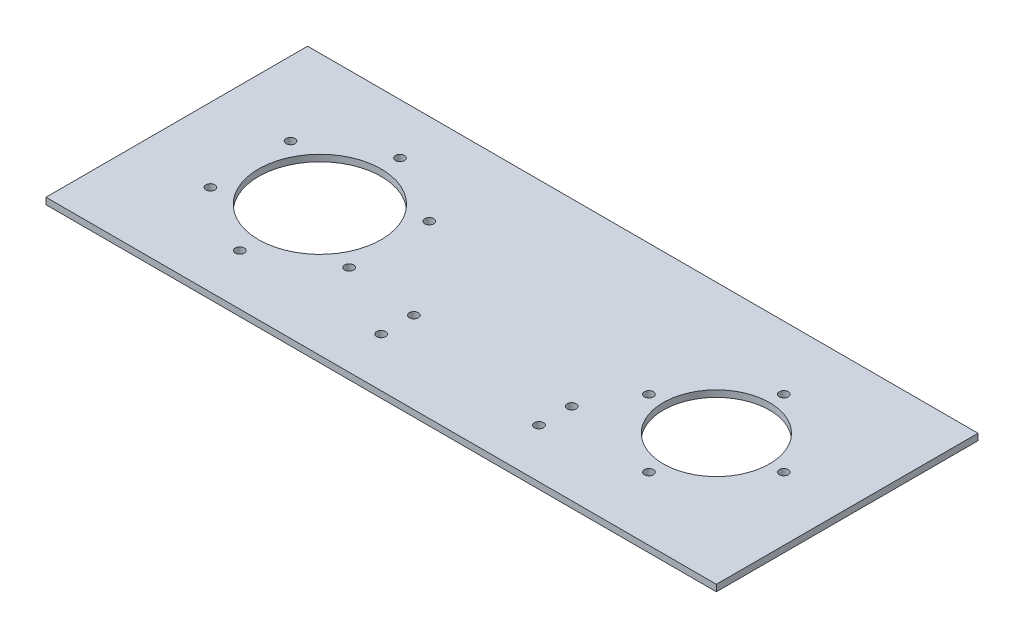
ISO-10303-21;
HEADER;
FILE_DESCRIPTION(('STEP AP214'),'2;1');
FILE_NAME('part.step','',(''),(''),'','','');
FILE_SCHEMA(('AUTOMOTIVE_DESIGN { 1 0 10303 214 1 1 1 1 }'));
ENDSEC;
DATA;
#1=APPLICATION_CONTEXT('core data for automotive mechanical design processes');
#2=APPLICATION_PROTOCOL_DEFINITION('international standard','automotive_design',2000,#1);
#3=PRODUCT_CONTEXT('',#1,'mechanical');
#4=PRODUCT('Part','Part','',(#3));
#5=PRODUCT_RELATED_PRODUCT_CATEGORY('part','',(#4));
#6=PRODUCT_DEFINITION_FORMATION('','',#4);
#7=PRODUCT_DEFINITION_CONTEXT('part definition',#1,'design');
#8=PRODUCT_DEFINITION('design','',#6,#7);
#9=PRODUCT_DEFINITION_SHAPE('','',#8);
#10=(LENGTH_UNIT() NAMED_UNIT(*) SI_UNIT(.MILLI.,.METRE.));
#11=(NAMED_UNIT(*) PLANE_ANGLE_UNIT() SI_UNIT($,.RADIAN.));
#12=(NAMED_UNIT(*) SI_UNIT($,.STERADIAN.) SOLID_ANGLE_UNIT());
#13=UNCERTAINTY_MEASURE_WITH_UNIT(LENGTH_MEASURE(1.E-05),#10,'distance_accuracy_value','');
#14=(GEOMETRIC_REPRESENTATION_CONTEXT(3) GLOBAL_UNCERTAINTY_ASSIGNED_CONTEXT((#13)) GLOBAL_UNIT_ASSIGNED_CONTEXT((#10,
#11,#12)) REPRESENTATION_CONTEXT('',''));
#15=CARTESIAN_POINT('',(0.,0.,0.));
#16=DIRECTION('',(0.,0.,1.));
#17=DIRECTION('',(1.,0.,0.));
#18=AXIS2_PLACEMENT_3D('',#15,#16,#17);
#19=CARTESIAN_POINT('',(0.,8.,160.));
#20=DIRECTION('',(0.,0.,-1.));
#21=DIRECTION('',(-1.,0.,0.));
#22=AXIS2_PLACEMENT_3D('',#19,#20,#21);
#23=PLANE('',#22);
#24=DIRECTION('',(1.,0.,0.));
#25=VECTOR('',#24,1.);
#26=CARTESIAN_POINT('',(0.,0.,160.));
#27=LINE('',#26,#25);
#28=CARTESIAN_POINT('',(-175.,0.,160.));
#29=VERTEX_POINT('',#28);
#30=CARTESIAN_POINT('',(645.,0.,160.));
#31=VERTEX_POINT('',#30);
#32=EDGE_CURVE('E137',#29,#31,#27,.T.);
#33=ORIENTED_EDGE('',*,*,#32,.T.);
#34=DIRECTION('',(0.,-1.,0.));
#35=VECTOR('',#34,1.);
#36=CARTESIAN_POINT('',(645.,8.,160.));
#37=LINE('',#36,#35);
#38=CARTESIAN_POINT('',(645.,8.,160.));
#39=VERTEX_POINT('',#38);
#40=EDGE_CURVE('E11',#39,#31,#37,.T.);
#41=ORIENTED_EDGE('',*,*,#40,.F.);
#42=DIRECTION('',(1.,0.,0.));
#43=VECTOR('',#42,1.);
#44=CARTESIAN_POINT('',(0.,8.,160.));
#45=LINE('',#44,#43);
#46=CARTESIAN_POINT('',(-175.,8.,160.));
#47=VERTEX_POINT('',#46);
#48=EDGE_CURVE('E86',#47,#39,#45,.T.);
#49=ORIENTED_EDGE('',*,*,#48,.F.);
#50=DIRECTION('',(0.,-1.,0.));
#51=VECTOR('',#50,1.);
#52=CARTESIAN_POINT('',(-175.,8.,160.));
#53=LINE('',#52,#51);
#54=EDGE_CURVE('E53',#47,#29,#53,.T.);
#55=ORIENTED_EDGE('',*,*,#54,.T.);
#56=EDGE_LOOP('',(#33,#41,#49,#55));
#57=FACE_BOUND('',#56,.T.);
#58=ADVANCED_FACE('F36',(#57),#23,.F.);
#59=CARTESIAN_POINT('',(645.,8.,0.));
#60=DIRECTION('',(-1.,0.,0.));
#61=DIRECTION('',(0.,0.,1.));
#62=AXIS2_PLACEMENT_3D('',#59,#60,#61);
#63=PLANE('',#62);
#64=DIRECTION('',(0.,0.,-1.));
#65=VECTOR('',#64,1.);
#66=CARTESIAN_POINT('',(645.,0.,0.));
#67=LINE('',#66,#65);
#68=CARTESIAN_POINT('',(645.,0.,-160.));
#69=VERTEX_POINT('',#68);
#70=EDGE_CURVE('E91',#31,#69,#67,.T.);
#71=ORIENTED_EDGE('',*,*,#70,.T.);
#72=DIRECTION('',(0.,-1.,0.));
#73=VECTOR('',#72,1.);
#74=CARTESIAN_POINT('',(645.,8.,-160.));
#75=LINE('',#74,#73);
#76=CARTESIAN_POINT('',(645.,8.,-160.));
#77=VERTEX_POINT('',#76);
#78=EDGE_CURVE('E45',#77,#69,#75,.T.);
#79=ORIENTED_EDGE('',*,*,#78,.F.);
#80=DIRECTION('',(0.,0.,-1.));
#81=VECTOR('',#80,1.);
#82=CARTESIAN_POINT('',(645.,8.,0.));
#83=LINE('',#82,#81);
#84=EDGE_CURVE('E78',#39,#77,#83,.T.);
#85=ORIENTED_EDGE('',*,*,#84,.F.);
#86=ORIENTED_EDGE('',*,*,#40,.T.);
#87=EDGE_LOOP('',(#71,#79,#85,#86));
#88=FACE_BOUND('',#87,.T.);
#89=ADVANCED_FACE('F90',(#88),#63,.F.);
#90=CARTESIAN_POINT('',(0.,8.,-160.));
#91=DIRECTION('',(0.,0.,-1.));
#92=DIRECTION('',(-1.,0.,0.));
#93=AXIS2_PLACEMENT_3D('',#90,#91,#92);
#94=PLANE('',#93);
#95=DIRECTION('',(1.,0.,0.));
#96=VECTOR('',#95,1.);
#97=CARTESIAN_POINT('',(0.,0.,-160.));
#98=LINE('',#97,#96);
#99=CARTESIAN_POINT('',(-175.,0.,-160.));
#100=VERTEX_POINT('',#99);
#101=EDGE_CURVE('E140',#100,#69,#98,.T.);
#102=ORIENTED_EDGE('',*,*,#101,.F.);
#103=DIRECTION('',(0.,-1.,0.));
#104=VECTOR('',#103,1.);
#105=CARTESIAN_POINT('',(-175.,8.,-160.));
#106=LINE('',#105,#104);
#107=CARTESIAN_POINT('',(-175.,8.,-160.));
#108=VERTEX_POINT('',#107);
#109=EDGE_CURVE('E67',#108,#100,#106,.T.);
#110=ORIENTED_EDGE('',*,*,#109,.F.);
#111=DIRECTION('',(1.,0.,0.));
#112=VECTOR('',#111,1.);
#113=CARTESIAN_POINT('',(0.,8.,-160.));
#114=LINE('',#113,#112);
#115=EDGE_CURVE('E85',#108,#77,#114,.T.);
#116=ORIENTED_EDGE('',*,*,#115,.T.);
#117=ORIENTED_EDGE('',*,*,#78,.T.);
#118=EDGE_LOOP('',(#102,#110,#116,#117));
#119=FACE_BOUND('',#118,.T.);
#120=ADVANCED_FACE('F94',(#119),#94,.T.);
#121=CARTESIAN_POINT('',(0.,8.,0.));
#122=DIRECTION('',(0.,-1.,0.));
#123=DIRECTION('',(0.,0.,-1.));
#124=AXIS2_PLACEMENT_3D('',#121,#122,#123);
#125=CYLINDRICAL_SURFACE('',#124,75.);
#126=CARTESIAN_POINT('',(0.,8.,0.));
#127=DIRECTION('',(0.,1.,0.));
#128=DIRECTION('',(0.,0.,1.));
#129=AXIS2_PLACEMENT_3D('',#126,#127,#128);
#130=CIRCLE('',#129,75.);
#131=CARTESIAN_POINT('',(0.,8.,75.));
#132=VERTEX_POINT('',#131);
#133=EDGE_CURVE('E185',#132,#132,#130,.T.);
#134=ORIENTED_EDGE('',*,*,#133,.T.);
#135=EDGE_LOOP('',(#134));
#136=FACE_BOUND('',#135,.T.);
#137=CARTESIAN_POINT('',(0.,0.,0.));
#138=DIRECTION('',(0.,1.,0.));
#139=DIRECTION('',(0.,0.,1.));
#140=AXIS2_PLACEMENT_3D('',#137,#138,#139);
#141=CIRCLE('',#140,75.);
#142=CARTESIAN_POINT('',(0.,0.,75.));
#143=VERTEX_POINT('',#142);
#144=EDGE_CURVE('E134',#143,#143,#141,.T.);
#145=ORIENTED_EDGE('',*,*,#144,.F.);
#146=EDGE_LOOP('',(#145));
#147=FACE_BOUND('',#146,.T.);
#148=ADVANCED_FACE('F189',(#136,#147),#125,.F.);
#149=CARTESIAN_POINT('',(0.,8.,98.));
#150=DIRECTION('',(0.,-1.,0.));
#151=DIRECTION('',(0.,0.,-1.));
#152=AXIS2_PLACEMENT_3D('',#149,#150,#151);
#153=CYLINDRICAL_SURFACE('',#152,5.5);
#154=CARTESIAN_POINT('',(0.,8.,98.));
#155=DIRECTION('',(0.,1.,0.));
#156=DIRECTION('',(0.,0.,1.));
#157=AXIS2_PLACEMENT_3D('',#154,#155,#156);
#158=CIRCLE('',#157,5.5);
#159=CARTESIAN_POINT('',(0.,8.,103.5));
#160=VERTEX_POINT('',#159);
#161=EDGE_CURVE('E182',#160,#160,#158,.T.);
#162=ORIENTED_EDGE('',*,*,#161,.T.);
#163=EDGE_LOOP('',(#162));
#164=FACE_BOUND('',#163,.T.);
#165=CARTESIAN_POINT('',(0.,0.,98.));
#166=DIRECTION('',(0.,1.,0.));
#167=DIRECTION('',(0.,0.,1.));
#168=AXIS2_PLACEMENT_3D('',#165,#166,#167);
#169=CIRCLE('',#168,5.5);
#170=CARTESIAN_POINT('',(0.,0.,103.5));
#171=VERTEX_POINT('',#170);
#172=EDGE_CURVE('E131',#171,#171,#169,.T.);
#173=ORIENTED_EDGE('',*,*,#172,.F.);
#174=EDGE_LOOP('',(#173));
#175=FACE_BOUND('',#174,.T.);
#176=ADVANCED_FACE('F218',(#164,#175),#153,.F.);
#177=CARTESIAN_POINT('',(-84.8704895708751,8.,48.9999999999998));
#178=DIRECTION('',(0.,-1.,0.));
#179=DIRECTION('',(0.,0.,-1.));
#180=AXIS2_PLACEMENT_3D('',#177,#178,#179);
#181=CYLINDRICAL_SURFACE('',#180,5.5);
#182=CARTESIAN_POINT('',(-84.8704895708751,8.,48.9999999999998));
#183=DIRECTION('',(0.,1.,0.));
#184=DIRECTION('',(0.,0.,1.));
#185=AXIS2_PLACEMENT_3D('',#182,#183,#184);
#186=CIRCLE('',#185,5.5);
#187=CARTESIAN_POINT('',(-84.8704895708751,8.,54.4999999999998));
#188=VERTEX_POINT('',#187);
#189=EDGE_CURVE('E179',#188,#188,#186,.T.);
#190=ORIENTED_EDGE('',*,*,#189,.T.);
#191=EDGE_LOOP('',(#190));
#192=FACE_BOUND('',#191,.T.);
#193=CARTESIAN_POINT('',(-84.8704895708751,0.,48.9999999999998));
#194=DIRECTION('',(0.,1.,0.));
#195=DIRECTION('',(0.,0.,1.));
#196=AXIS2_PLACEMENT_3D('',#193,#194,#195);
#197=CIRCLE('',#196,5.5);
#198=CARTESIAN_POINT('',(-84.8704895708751,0.,54.4999999999998));
#199=VERTEX_POINT('',#198);
#200=EDGE_CURVE('E128',#199,#199,#197,.T.);
#201=ORIENTED_EDGE('',*,*,#200,.F.);
#202=EDGE_LOOP('',(#201));
#203=FACE_BOUND('',#202,.T.);
#204=ADVANCED_FACE('F221',(#192,#203),#181,.F.);
#205=CARTESIAN_POINT('',(-84.8704895708748,8.,-49.0000000000004));
#206=DIRECTION('',(0.,-1.,0.));
#207=DIRECTION('',(0.,0.,-1.));
#208=AXIS2_PLACEMENT_3D('',#205,#206,#207);
#209=CYLINDRICAL_SURFACE('',#208,5.5);
#210=CARTESIAN_POINT('',(-84.8704895708748,8.,-49.0000000000004));
#211=DIRECTION('',(0.,1.,0.));
#212=DIRECTION('',(0.,0.,1.));
#213=AXIS2_PLACEMENT_3D('',#210,#211,#212);
#214=CIRCLE('',#213,5.5);
#215=CARTESIAN_POINT('',(-84.8704895708748,8.,-43.5000000000004));
#216=VERTEX_POINT('',#215);
#217=EDGE_CURVE('E176',#216,#216,#214,.T.);
#218=ORIENTED_EDGE('',*,*,#217,.T.);
#219=EDGE_LOOP('',(#218));
#220=FACE_BOUND('',#219,.T.);
#221=CARTESIAN_POINT('',(-84.8704895708748,0.,-49.0000000000004));
#222=DIRECTION('',(0.,1.,0.));
#223=DIRECTION('',(0.,0.,1.));
#224=AXIS2_PLACEMENT_3D('',#221,#222,#223);
#225=CIRCLE('',#224,5.5);
#226=CARTESIAN_POINT('',(-84.8704895708748,0.,-43.5000000000004));
#227=VERTEX_POINT('',#226);
#228=EDGE_CURVE('E125',#227,#227,#225,.T.);
#229=ORIENTED_EDGE('',*,*,#228,.F.);
#230=EDGE_LOOP('',(#229));
#231=FACE_BOUND('',#230,.T.);
#232=ADVANCED_FACE('F225',(#220,#231),#209,.F.);
#233=CARTESIAN_POINT('',(6.84330342413254E-13,8.,-98.));
#234=DIRECTION('',(0.,-1.,0.));
#235=DIRECTION('',(0.,0.,-1.));
#236=AXIS2_PLACEMENT_3D('',#233,#234,#235);
#237=CYLINDRICAL_SURFACE('',#236,5.5);
#238=CARTESIAN_POINT('',(6.84330342413254E-13,8.,-98.));
#239=DIRECTION('',(0.,1.,0.));
#240=DIRECTION('',(0.,0.,1.));
#241=AXIS2_PLACEMENT_3D('',#238,#239,#240);
#242=CIRCLE('',#241,5.5);
#243=CARTESIAN_POINT('',(6.84330342413254E-13,8.,-92.5));
#244=VERTEX_POINT('',#243);
#245=EDGE_CURVE('E173',#244,#244,#242,.T.);
#246=ORIENTED_EDGE('',*,*,#245,.T.);
#247=EDGE_LOOP('',(#246));
#248=FACE_BOUND('',#247,.T.);
#249=CARTESIAN_POINT('',(6.84330342413254E-13,0.,-98.));
#250=DIRECTION('',(0.,1.,0.));
#251=DIRECTION('',(0.,0.,1.));
#252=AXIS2_PLACEMENT_3D('',#249,#250,#251);
#253=CIRCLE('',#252,5.5);
#254=CARTESIAN_POINT('',(6.84330342413254E-13,0.,-92.5));
#255=VERTEX_POINT('',#254);
#256=EDGE_CURVE('E122',#255,#255,#253,.T.);
#257=ORIENTED_EDGE('',*,*,#256,.F.);
#258=EDGE_LOOP('',(#257));
#259=FACE_BOUND('',#258,.T.);
#260=ADVANCED_FACE('F229',(#248,#259),#237,.F.);
#261=CARTESIAN_POINT('',(84.8704895708754,8.,-48.9999999999992));
#262=DIRECTION('',(0.,-1.,0.));
#263=DIRECTION('',(0.,0.,-1.));
#264=AXIS2_PLACEMENT_3D('',#261,#262,#263);
#265=CYLINDRICAL_SURFACE('',#264,5.5);
#266=CARTESIAN_POINT('',(84.8704895708754,8.,-48.9999999999992));
#267=DIRECTION('',(0.,1.,0.));
#268=DIRECTION('',(0.,0.,1.));
#269=AXIS2_PLACEMENT_3D('',#266,#267,#268);
#270=CIRCLE('',#269,5.5);
#271=CARTESIAN_POINT('',(84.8704895708754,8.,-43.4999999999992));
#272=VERTEX_POINT('',#271);
#273=EDGE_CURVE('E170',#272,#272,#270,.T.);
#274=ORIENTED_EDGE('',*,*,#273,.T.);
#275=EDGE_LOOP('',(#274));
#276=FACE_BOUND('',#275,.T.);
#277=CARTESIAN_POINT('',(84.8704895708754,0.,-48.9999999999992));
#278=DIRECTION('',(0.,1.,0.));
#279=DIRECTION('',(0.,0.,1.));
#280=AXIS2_PLACEMENT_3D('',#277,#278,#279);
#281=CIRCLE('',#280,5.5);
#282=CARTESIAN_POINT('',(84.8704895708754,0.,-43.4999999999992));
#283=VERTEX_POINT('',#282);
#284=EDGE_CURVE('E119',#283,#283,#281,.T.);
#285=ORIENTED_EDGE('',*,*,#284,.F.);
#286=EDGE_LOOP('',(#285));
#287=FACE_BOUND('',#286,.T.);
#288=ADVANCED_FACE('F233',(#276,#287),#265,.F.);
#289=CARTESIAN_POINT('',(84.8704895708744,8.,49.000000000001));
#290=DIRECTION('',(0.,-1.,0.));
#291=DIRECTION('',(0.,0.,-1.));
#292=AXIS2_PLACEMENT_3D('',#289,#290,#291);
#293=CYLINDRICAL_SURFACE('',#292,5.5);
#294=CARTESIAN_POINT('',(84.8704895708744,8.,49.000000000001));
#295=DIRECTION('',(0.,1.,0.));
#296=DIRECTION('',(0.,0.,1.));
#297=AXIS2_PLACEMENT_3D('',#294,#295,#296);
#298=CIRCLE('',#297,5.5);
#299=CARTESIAN_POINT('',(84.8704895708744,8.,54.500000000001));
#300=VERTEX_POINT('',#299);
#301=EDGE_CURVE('E167',#300,#300,#298,.T.);
#302=ORIENTED_EDGE('',*,*,#301,.T.);
#303=EDGE_LOOP('',(#302));
#304=FACE_BOUND('',#303,.T.);
#305=CARTESIAN_POINT('',(84.8704895708744,0.,49.000000000001));
#306=DIRECTION('',(0.,1.,0.));
#307=DIRECTION('',(0.,0.,1.));
#308=AXIS2_PLACEMENT_3D('',#305,#306,#307);
#309=CIRCLE('',#308,5.5);
#310=CARTESIAN_POINT('',(84.8704895708744,0.,54.500000000001));
#311=VERTEX_POINT('',#310);
#312=EDGE_CURVE('E116',#311,#311,#309,.T.);
#313=ORIENTED_EDGE('',*,*,#312,.F.);
#314=EDGE_LOOP('',(#313));
#315=FACE_BOUND('',#314,.T.);
#316=ADVANCED_FACE('F237',(#304,#315),#293,.F.);
#317=CARTESIAN_POINT('',(485.,8.,0.));
#318=DIRECTION('',(0.,-1.,0.));
#319=DIRECTION('',(0.,0.,-1.));
#320=AXIS2_PLACEMENT_3D('',#317,#318,#319);
#321=CYLINDRICAL_SURFACE('',#320,64.9999999999999);
#322=CARTESIAN_POINT('',(485.,8.,0.));
#323=DIRECTION('',(0.,1.,0.));
#324=DIRECTION('',(0.,0.,1.));
#325=AXIS2_PLACEMENT_3D('',#322,#323,#324);
#326=CIRCLE('',#325,64.9999999999999);
#327=CARTESIAN_POINT('',(485.,8.,64.9999999999999));
#328=VERTEX_POINT('',#327);
#329=EDGE_CURVE('E164',#328,#328,#326,.T.);
#330=ORIENTED_EDGE('',*,*,#329,.T.);
#331=EDGE_LOOP('',(#330));
#332=FACE_BOUND('',#331,.T.);
#333=CARTESIAN_POINT('',(485.,0.,0.));
#334=DIRECTION('',(0.,1.,0.));
#335=DIRECTION('',(0.,0.,1.));
#336=AXIS2_PLACEMENT_3D('',#333,#334,#335);
#337=CIRCLE('',#336,64.9999999999999);
#338=CARTESIAN_POINT('',(485.,0.,64.9999999999999));
#339=VERTEX_POINT('',#338);
#340=EDGE_CURVE('E113',#339,#339,#337,.T.);
#341=ORIENTED_EDGE('',*,*,#340,.F.);
#342=EDGE_LOOP('',(#341));
#343=FACE_BOUND('',#342,.T.);
#344=ADVANCED_FACE('F241',(#332,#343),#321,.F.);
#345=CARTESIAN_POINT('',(567.5,8.,0.));
#346=DIRECTION('',(0.,-1.,0.));
#347=DIRECTION('',(0.,0.,-1.));
#348=AXIS2_PLACEMENT_3D('',#345,#346,#347);
#349=CYLINDRICAL_SURFACE('',#348,5.50000000000007);
#350=CARTESIAN_POINT('',(567.5,8.,0.));
#351=DIRECTION('',(0.,1.,0.));
#352=DIRECTION('',(0.,0.,1.));
#353=AXIS2_PLACEMENT_3D('',#350,#351,#352);
#354=CIRCLE('',#353,5.50000000000007);
#355=CARTESIAN_POINT('',(567.5,8.,5.50000000000007));
#356=VERTEX_POINT('',#355);
#357=EDGE_CURVE('E161',#356,#356,#354,.T.);
#358=ORIENTED_EDGE('',*,*,#357,.T.);
#359=EDGE_LOOP('',(#358));
#360=FACE_BOUND('',#359,.T.);
#361=CARTESIAN_POINT('',(567.5,0.,0.));
#362=DIRECTION('',(0.,1.,0.));
#363=DIRECTION('',(0.,0.,1.));
#364=AXIS2_PLACEMENT_3D('',#361,#362,#363);
#365=CIRCLE('',#364,5.50000000000007);
#366=CARTESIAN_POINT('',(567.5,0.,5.50000000000007));
#367=VERTEX_POINT('',#366);
#368=EDGE_CURVE('E110',#367,#367,#365,.T.);
#369=ORIENTED_EDGE('',*,*,#368,.F.);
#370=EDGE_LOOP('',(#369));
#371=FACE_BOUND('',#370,.T.);
#372=ADVANCED_FACE('F245',(#360,#371),#349,.F.);
#373=CARTESIAN_POINT('',(485.,8.,82.5));
#374=DIRECTION('',(0.,-1.,0.));
#375=DIRECTION('',(0.,0.,-1.));
#376=AXIS2_PLACEMENT_3D('',#373,#374,#375);
#377=CYLINDRICAL_SURFACE('',#376,5.50000000000007);
#378=CARTESIAN_POINT('',(485.,8.,82.5));
#379=DIRECTION('',(0.,1.,0.));
#380=DIRECTION('',(0.,0.,1.));
#381=AXIS2_PLACEMENT_3D('',#378,#379,#380);
#382=CIRCLE('',#381,5.50000000000007);
#383=CARTESIAN_POINT('',(485.,8.,88.0000000000001));
#384=VERTEX_POINT('',#383);
#385=EDGE_CURVE('E154',#384,#384,#382,.T.);
#386=ORIENTED_EDGE('',*,*,#385,.T.);
#387=EDGE_LOOP('',(#386));
#388=FACE_BOUND('',#387,.T.);
#389=CARTESIAN_POINT('',(485.,0.,82.5));
#390=DIRECTION('',(0.,1.,0.));
#391=DIRECTION('',(0.,0.,1.));
#392=AXIS2_PLACEMENT_3D('',#389,#390,#391);
#393=CIRCLE('',#392,5.50000000000007);
#394=CARTESIAN_POINT('',(485.,0.,88.0000000000001));
#395=VERTEX_POINT('',#394);
#396=EDGE_CURVE('E107',#395,#395,#393,.T.);
#397=ORIENTED_EDGE('',*,*,#396,.F.);
#398=EDGE_LOOP('',(#397));
#399=FACE_BOUND('',#398,.T.);
#400=ADVANCED_FACE('F249',(#388,#399),#377,.F.);
#401=CARTESIAN_POINT('',(402.5,8.,0.));
#402=DIRECTION('',(0.,-1.,0.));
#403=DIRECTION('',(0.,0.,-1.));
#404=AXIS2_PLACEMENT_3D('',#401,#402,#403);
#405=CYLINDRICAL_SURFACE('',#404,5.50000000000007);
#406=CARTESIAN_POINT('',(402.5,8.,0.));
#407=DIRECTION('',(0.,1.,0.));
#408=DIRECTION('',(0.,0.,1.));
#409=AXIS2_PLACEMENT_3D('',#406,#407,#408);
#410=CIRCLE('',#409,5.50000000000007);
#411=CARTESIAN_POINT('',(402.5,8.,5.50000000000006));
#412=VERTEX_POINT('',#411);
#413=EDGE_CURVE('E149',#412,#412,#410,.T.);
#414=ORIENTED_EDGE('',*,*,#413,.T.);
#415=EDGE_LOOP('',(#414));
#416=FACE_BOUND('',#415,.T.);
#417=CARTESIAN_POINT('',(402.5,0.,0.));
#418=DIRECTION('',(0.,1.,0.));
#419=DIRECTION('',(0.,0.,1.));
#420=AXIS2_PLACEMENT_3D('',#417,#418,#419);
#421=CIRCLE('',#420,5.50000000000007);
#422=CARTESIAN_POINT('',(402.5,0.,5.50000000000006));
#423=VERTEX_POINT('',#422);
#424=EDGE_CURVE('E103',#423,#423,#421,.T.);
#425=ORIENTED_EDGE('',*,*,#424,.F.);
#426=EDGE_LOOP('',(#425));
#427=FACE_BOUND('',#426,.T.);
#428=ADVANCED_FACE('F252',(#416,#427),#405,.F.);
#429=CARTESIAN_POINT('',(485.,8.,-82.5));
#430=DIRECTION('',(0.,-1.,0.));
#431=DIRECTION('',(0.,0.,-1.));
#432=AXIS2_PLACEMENT_3D('',#429,#430,#431);
#433=CYLINDRICAL_SURFACE('',#432,5.50000000000007);
#434=CARTESIAN_POINT('',(485.,8.,-82.5));
#435=DIRECTION('',(0.,1.,0.));
#436=DIRECTION('',(0.,0.,1.));
#437=AXIS2_PLACEMENT_3D('',#434,#435,#436);
#438=CIRCLE('',#437,5.50000000000007);
#439=CARTESIAN_POINT('',(485.,8.,-76.9999999999999));
#440=VERTEX_POINT('',#439);
#441=EDGE_CURVE('E145',#440,#440,#438,.T.);
#442=ORIENTED_EDGE('',*,*,#441,.T.);
#443=EDGE_LOOP('',(#442));
#444=FACE_BOUND('',#443,.T.);
#445=CARTESIAN_POINT('',(485.,0.,-82.5));
#446=DIRECTION('',(0.,1.,0.));
#447=DIRECTION('',(0.,0.,1.));
#448=AXIS2_PLACEMENT_3D('',#445,#446,#447);
#449=CIRCLE('',#448,5.50000000000007);
#450=CARTESIAN_POINT('',(485.,0.,-76.9999999999999));
#451=VERTEX_POINT('',#450);
#452=EDGE_CURVE('E100',#451,#451,#449,.T.);
#453=ORIENTED_EDGE('',*,*,#452,.F.);
#454=EDGE_LOOP('',(#453));
#455=FACE_BOUND('',#454,.T.);
#456=ADVANCED_FACE('F38',(#444,#455),#433,.F.);
#457=CARTESIAN_POINT('',(-175.,8.,0.));
#458=DIRECTION('',(-1.,0.,0.));
#459=DIRECTION('',(0.,0.,1.));
#460=AXIS2_PLACEMENT_3D('',#457,#458,#459);
#461=PLANE('',#460);
#462=DIRECTION('',(0.,0.,-1.));
#463=VECTOR('',#462,1.);
#464=CARTESIAN_POINT('',(-175.,0.,0.));
#465=LINE('',#464,#463);
#466=EDGE_CURVE('E142',#29,#100,#465,.T.);
#467=ORIENTED_EDGE('',*,*,#466,.F.);
#468=ORIENTED_EDGE('',*,*,#54,.F.);
#469=DIRECTION('',(0.,0.,-1.));
#470=VECTOR('',#469,1.);
#471=CARTESIAN_POINT('',(-175.,8.,0.));
#472=LINE('',#471,#470);
#473=EDGE_CURVE('E95',#47,#108,#472,.T.);
#474=ORIENTED_EDGE('',*,*,#473,.T.);
#475=ORIENTED_EDGE('',*,*,#109,.T.);
#476=EDGE_LOOP('',(#467,#468,#474,#475));
#477=FACE_BOUND('',#476,.T.);
#478=ADVANCED_FACE('F194',(#477),#461,.T.);
#479=CARTESIAN_POINT('',(0.,8.,0.));
#480=DIRECTION('',(0.,1.,0.));
#481=DIRECTION('',(0.,0.,1.));
#482=AXIS2_PLACEMENT_3D('',#479,#480,#481);
#483=PLANE('',#482);
#484=CARTESIAN_POINT('',(175.,8.,60.));
#485=DIRECTION('',(0.,1.,0.));
#486=DIRECTION('',(0.,0.,1.));
#487=AXIS2_PLACEMENT_3D('',#484,#485,#486);
#488=CIRCLE('',#487,5.50000000000002);
#489=CARTESIAN_POINT('',(175.,8.,65.5));
#490=VERTEX_POINT('',#489);
#491=EDGE_CURVE('E104',#490,#490,#488,.F.);
#492=ORIENTED_EDGE('',*,*,#491,.T.);
#493=EDGE_LOOP('',(#492));
#494=FACE_BOUND('',#493,.T.);
#495=CARTESIAN_POINT('',(368.,8.,100.));
#496=DIRECTION('',(0.,1.,0.));
#497=DIRECTION('',(0.,0.,1.));
#498=AXIS2_PLACEMENT_3D('',#495,#496,#497);
#499=CIRCLE('',#498,5.50000000000002);
#500=CARTESIAN_POINT('',(368.,8.,105.5));
#501=VERTEX_POINT('',#500);
#502=EDGE_CURVE('E392',#501,#501,#499,.F.);
#503=ORIENTED_EDGE('',*,*,#502,.T.);
#504=EDGE_LOOP('',(#503));
#505=FACE_BOUND('',#504,.T.);
#506=CARTESIAN_POINT('',(368.,8.,60.));
#507=DIRECTION('',(0.,1.,0.));
#508=DIRECTION('',(0.,0.,1.));
#509=AXIS2_PLACEMENT_3D('',#506,#507,#508);
#510=CIRCLE('',#509,5.50000000000002);
#511=CARTESIAN_POINT('',(368.,8.,65.5));
#512=VERTEX_POINT('',#511);
#513=EDGE_CURVE('E390',#512,#512,#510,.F.);
#514=ORIENTED_EDGE('',*,*,#513,.T.);
#515=EDGE_LOOP('',(#514));
#516=FACE_BOUND('',#515,.T.);
#517=CARTESIAN_POINT('',(175.,8.,100.));
#518=DIRECTION('',(0.,1.,0.));
#519=DIRECTION('',(0.,0.,1.));
#520=AXIS2_PLACEMENT_3D('',#517,#518,#519);
#521=CIRCLE('',#520,5.50000000000002);
#522=CARTESIAN_POINT('',(175.,8.,105.5));
#523=VERTEX_POINT('',#522);
#524=EDGE_CURVE('E381',#523,#523,#521,.F.);
#525=ORIENTED_EDGE('',*,*,#524,.T.);
#526=EDGE_LOOP('',(#525));
#527=FACE_BOUND('',#526,.T.);
#528=ORIENTED_EDGE('',*,*,#441,.F.);
#529=EDGE_LOOP('',(#528));
#530=FACE_BOUND('',#529,.T.);
#531=ORIENTED_EDGE('',*,*,#413,.F.);
#532=EDGE_LOOP('',(#531));
#533=FACE_BOUND('',#532,.T.);
#534=ORIENTED_EDGE('',*,*,#385,.F.);
#535=EDGE_LOOP('',(#534));
#536=FACE_BOUND('',#535,.T.);
#537=ORIENTED_EDGE('',*,*,#357,.F.);
#538=EDGE_LOOP('',(#537));
#539=FACE_BOUND('',#538,.T.);
#540=ORIENTED_EDGE('',*,*,#329,.F.);
#541=EDGE_LOOP('',(#540));
#542=FACE_BOUND('',#541,.T.);
#543=ORIENTED_EDGE('',*,*,#301,.F.);
#544=EDGE_LOOP('',(#543));
#545=FACE_BOUND('',#544,.T.);
#546=ORIENTED_EDGE('',*,*,#273,.F.);
#547=EDGE_LOOP('',(#546));
#548=FACE_BOUND('',#547,.T.);
#549=ORIENTED_EDGE('',*,*,#245,.F.);
#550=EDGE_LOOP('',(#549));
#551=FACE_BOUND('',#550,.T.);
#552=ORIENTED_EDGE('',*,*,#217,.F.);
#553=EDGE_LOOP('',(#552));
#554=FACE_BOUND('',#553,.T.);
#555=ORIENTED_EDGE('',*,*,#189,.F.);
#556=EDGE_LOOP('',(#555));
#557=FACE_BOUND('',#556,.T.);
#558=ORIENTED_EDGE('',*,*,#161,.F.);
#559=EDGE_LOOP('',(#558));
#560=FACE_BOUND('',#559,.T.);
#561=ORIENTED_EDGE('',*,*,#133,.F.);
#562=EDGE_LOOP('',(#561));
#563=FACE_BOUND('',#562,.T.);
#564=ORIENTED_EDGE('',*,*,#48,.T.);
#565=ORIENTED_EDGE('',*,*,#84,.T.);
#566=ORIENTED_EDGE('',*,*,#115,.F.);
#567=ORIENTED_EDGE('',*,*,#473,.F.);
#568=EDGE_LOOP('',(#564,#565,#566,#567));
#569=FACE_BOUND('',#568,.T.);
#570=ADVANCED_FACE('F82',(#494,#505,#516,#527,#530,#533,#536,#539,#542,#545,#548,#551,#554,#557,
#560,#563,#569),#483,.T.);
#571=CARTESIAN_POINT('',(0.,0.,0.));
#572=DIRECTION('',(0.,1.,0.));
#573=DIRECTION('',(0.,0.,1.));
#574=AXIS2_PLACEMENT_3D('',#571,#572,#573);
#575=PLANE('',#574);
#576=CARTESIAN_POINT('',(175.,0.,60.));
#577=DIRECTION('',(0.,1.,0.));
#578=DIRECTION('',(0.,0.,1.));
#579=AXIS2_PLACEMENT_3D('',#576,#577,#578);
#580=CIRCLE('',#579,5.50000000000002);
#581=CARTESIAN_POINT('',(175.,0.,65.5));
#582=VERTEX_POINT('',#581);
#583=EDGE_CURVE('E376',#582,#582,#580,.T.);
#584=ORIENTED_EDGE('',*,*,#583,.T.);
#585=EDGE_LOOP('',(#584));
#586=FACE_BOUND('',#585,.T.);
#587=CARTESIAN_POINT('',(368.,0.,100.));
#588=DIRECTION('',(0.,1.,0.));
#589=DIRECTION('',(0.,0.,1.));
#590=AXIS2_PLACEMENT_3D('',#587,#588,#589);
#591=CIRCLE('',#590,5.50000000000002);
#592=CARTESIAN_POINT('',(368.,0.,105.5));
#593=VERTEX_POINT('',#592);
#594=EDGE_CURVE('E378',#593,#593,#591,.T.);
#595=ORIENTED_EDGE('',*,*,#594,.T.);
#596=EDGE_LOOP('',(#595));
#597=FACE_BOUND('',#596,.T.);
#598=CARTESIAN_POINT('',(368.,0.,60.));
#599=DIRECTION('',(0.,1.,0.));
#600=DIRECTION('',(0.,0.,1.));
#601=AXIS2_PLACEMENT_3D('',#598,#599,#600);
#602=CIRCLE('',#601,5.50000000000002);
#603=CARTESIAN_POINT('',(368.,0.,65.5));
#604=VERTEX_POINT('',#603);
#605=EDGE_CURVE('E384',#604,#604,#602,.T.);
#606=ORIENTED_EDGE('',*,*,#605,.T.);
#607=EDGE_LOOP('',(#606));
#608=FACE_BOUND('',#607,.T.);
#609=CARTESIAN_POINT('',(175.,0.,100.));
#610=DIRECTION('',(0.,1.,0.));
#611=DIRECTION('',(0.,0.,1.));
#612=AXIS2_PLACEMENT_3D('',#609,#610,#611);
#613=CIRCLE('',#612,5.50000000000002);
#614=CARTESIAN_POINT('',(175.,0.,105.5));
#615=VERTEX_POINT('',#614);
#616=EDGE_CURVE('E377',#615,#615,#613,.T.);
#617=ORIENTED_EDGE('',*,*,#616,.T.);
#618=EDGE_LOOP('',(#617));
#619=FACE_BOUND('',#618,.T.);
#620=ORIENTED_EDGE('',*,*,#452,.T.);
#621=EDGE_LOOP('',(#620));
#622=FACE_BOUND('',#621,.T.);
#623=ORIENTED_EDGE('',*,*,#424,.T.);
#624=EDGE_LOOP('',(#623));
#625=FACE_BOUND('',#624,.T.);
#626=ORIENTED_EDGE('',*,*,#396,.T.);
#627=EDGE_LOOP('',(#626));
#628=FACE_BOUND('',#627,.T.);
#629=ORIENTED_EDGE('',*,*,#368,.T.);
#630=EDGE_LOOP('',(#629));
#631=FACE_BOUND('',#630,.T.);
#632=ORIENTED_EDGE('',*,*,#340,.T.);
#633=EDGE_LOOP('',(#632));
#634=FACE_BOUND('',#633,.T.);
#635=ORIENTED_EDGE('',*,*,#312,.T.);
#636=EDGE_LOOP('',(#635));
#637=FACE_BOUND('',#636,.T.);
#638=ORIENTED_EDGE('',*,*,#284,.T.);
#639=EDGE_LOOP('',(#638));
#640=FACE_BOUND('',#639,.T.);
#641=ORIENTED_EDGE('',*,*,#256,.T.);
#642=EDGE_LOOP('',(#641));
#643=FACE_BOUND('',#642,.T.);
#644=ORIENTED_EDGE('',*,*,#228,.T.);
#645=EDGE_LOOP('',(#644));
#646=FACE_BOUND('',#645,.T.);
#647=ORIENTED_EDGE('',*,*,#200,.T.);
#648=EDGE_LOOP('',(#647));
#649=FACE_BOUND('',#648,.T.);
#650=ORIENTED_EDGE('',*,*,#172,.T.);
#651=EDGE_LOOP('',(#650));
#652=FACE_BOUND('',#651,.T.);
#653=ORIENTED_EDGE('',*,*,#144,.T.);
#654=EDGE_LOOP('',(#653));
#655=FACE_BOUND('',#654,.T.);
#656=ORIENTED_EDGE('',*,*,#32,.F.);
#657=ORIENTED_EDGE('',*,*,#466,.T.);
#658=ORIENTED_EDGE('',*,*,#101,.T.);
#659=ORIENTED_EDGE('',*,*,#70,.F.);
#660=EDGE_LOOP('',(#656,#657,#658,#659));
#661=FACE_BOUND('',#660,.T.);
#662=ADVANCED_FACE('F193',(#586,#597,#608,#619,#622,#625,#628,#631,#634,#637,#640,#643,#646,
#649,#652,#655,#661),#575,.F.);
#663=CARTESIAN_POINT('',(175.,10.,100.));
#664=DIRECTION('',(0.,-1.,0.));
#665=DIRECTION('',(0.,0.,-1.));
#666=AXIS2_PLACEMENT_3D('',#663,#664,#665);
#667=CYLINDRICAL_SURFACE('',#666,5.50000000000002);
#668=ORIENTED_EDGE('',*,*,#524,.F.);
#669=EDGE_LOOP('',(#668));
#670=FACE_BOUND('',#669,.T.);
#671=ORIENTED_EDGE('',*,*,#616,.F.);
#672=EDGE_LOOP('',(#671));
#673=FACE_BOUND('',#672,.T.);
#674=ADVANCED_FACE('F201',(#670,#673),#667,.F.);
#675=CARTESIAN_POINT('',(368.,10.,60.));
#676=DIRECTION('',(0.,-1.,0.));
#677=DIRECTION('',(0.,0.,-1.));
#678=AXIS2_PLACEMENT_3D('',#675,#676,#677);
#679=CYLINDRICAL_SURFACE('',#678,5.50000000000002);
#680=ORIENTED_EDGE('',*,*,#513,.F.);
#681=EDGE_LOOP('',(#680));
#682=FACE_BOUND('',#681,.T.);
#683=ORIENTED_EDGE('',*,*,#605,.F.);
#684=EDGE_LOOP('',(#683));
#685=FACE_BOUND('',#684,.T.);
#686=ADVANCED_FACE('F339',(#682,#685),#679,.F.);
#687=CARTESIAN_POINT('',(368.,10.,100.));
#688=DIRECTION('',(0.,-1.,0.));
#689=DIRECTION('',(0.,0.,-1.));
#690=AXIS2_PLACEMENT_3D('',#687,#688,#689);
#691=CYLINDRICAL_SURFACE('',#690,5.50000000000002);
#692=ORIENTED_EDGE('',*,*,#502,.F.);
#693=EDGE_LOOP('',(#692));
#694=FACE_BOUND('',#693,.T.);
#695=ORIENTED_EDGE('',*,*,#594,.F.);
#696=EDGE_LOOP('',(#695));
#697=FACE_BOUND('',#696,.T.);
#698=ADVANCED_FACE('F348',(#694,#697),#691,.F.);
#699=CARTESIAN_POINT('',(175.,10.,60.));
#700=DIRECTION('',(0.,-1.,0.));
#701=DIRECTION('',(0.,0.,-1.));
#702=AXIS2_PLACEMENT_3D('',#699,#700,#701);
#703=CYLINDRICAL_SURFACE('',#702,5.50000000000002);
#704=ORIENTED_EDGE('',*,*,#491,.F.);
#705=EDGE_LOOP('',(#704));
#706=FACE_BOUND('',#705,.T.);
#707=ORIENTED_EDGE('',*,*,#583,.F.);
#708=EDGE_LOOP('',(#707));
#709=FACE_BOUND('',#708,.T.);
#710=ADVANCED_FACE('F358',(#706,#709),#703,.F.);
#711=CLOSED_SHELL('',(#58,#89,#120,#148,#176,#204,#232,#260,#288,#316,#344,#372,#400,#428,#456,
#478,#570,#662,#674,#686,#698,#710));
#712=MANIFOLD_SOLID_BREP('B2',#711);
#713=ADVANCED_BREP_SHAPE_REPRESENTATION('',(#18,#712),#14);
#714=SHAPE_DEFINITION_REPRESENTATION(#9,#713);
ENDSEC;
END-ISO-10303-21;
